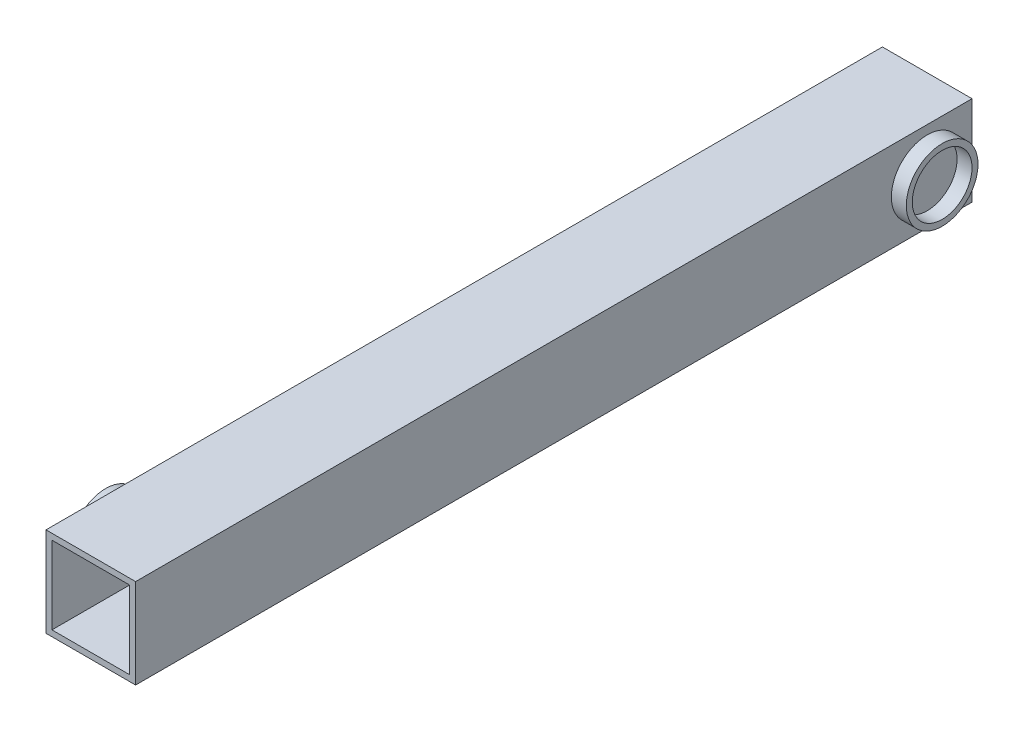
ISO-10303-21;
HEADER;
FILE_DESCRIPTION(('STEP AP214'),'2;1');
FILE_NAME('part.step','',(''),(''),'','','');
FILE_SCHEMA(('AUTOMOTIVE_DESIGN { 1 0 10303 214 1 1 1 1 }'));
ENDSEC;
DATA;
#1=APPLICATION_CONTEXT('core data for automotive mechanical design processes');
#2=APPLICATION_PROTOCOL_DEFINITION('international standard','automotive_design',2000,#1);
#3=PRODUCT_CONTEXT('',#1,'mechanical');
#4=PRODUCT('Part','Part','',(#3));
#5=PRODUCT_RELATED_PRODUCT_CATEGORY('part','',(#4));
#6=PRODUCT_DEFINITION_FORMATION('','',#4);
#7=PRODUCT_DEFINITION_CONTEXT('part definition',#1,'design');
#8=PRODUCT_DEFINITION('design','',#6,#7);
#9=PRODUCT_DEFINITION_SHAPE('','',#8);
#10=(LENGTH_UNIT() NAMED_UNIT(*) SI_UNIT(.MILLI.,.METRE.));
#11=(NAMED_UNIT(*) PLANE_ANGLE_UNIT() SI_UNIT($,.RADIAN.));
#12=(NAMED_UNIT(*) SI_UNIT($,.STERADIAN.) SOLID_ANGLE_UNIT());
#13=UNCERTAINTY_MEASURE_WITH_UNIT(LENGTH_MEASURE(1.E-05),#10,'distance_accuracy_value','');
#14=(GEOMETRIC_REPRESENTATION_CONTEXT(3) GLOBAL_UNCERTAINTY_ASSIGNED_CONTEXT((#13)) GLOBAL_UNIT_ASSIGNED_CONTEXT((#10,
#11,#12)) REPRESENTATION_CONTEXT('',''));
#15=CARTESIAN_POINT('',(0.,0.,0.));
#16=DIRECTION('',(0.,0.,1.));
#17=DIRECTION('',(1.,0.,0.));
#18=AXIS2_PLACEMENT_3D('',#15,#16,#17);
#19=CARTESIAN_POINT('',(0.,0.,280.));
#20=DIRECTION('',(0.,0.,1.));
#21=DIRECTION('',(1.,0.,0.));
#22=AXIS2_PLACEMENT_3D('',#19,#20,#21);
#23=PLANE('',#22);
#24=DIRECTION('',(0.,1.,0.));
#25=VECTOR('',#24,1.);
#26=CARTESIAN_POINT('',(15.,15.,280.));
#27=LINE('',#26,#25);
#28=CARTESIAN_POINT('',(15.,-15.,280.));
#29=VERTEX_POINT('',#28);
#30=CARTESIAN_POINT('',(15.,15.,280.));
#31=VERTEX_POINT('',#30);
#32=EDGE_CURVE('E136',#29,#31,#27,.T.);
#33=ORIENTED_EDGE('',*,*,#32,.T.);
#34=DIRECTION('',(-1.,0.,0.));
#35=VECTOR('',#34,1.);
#36=CARTESIAN_POINT('',(-15.,15.,280.));
#37=LINE('',#36,#35);
#38=CARTESIAN_POINT('',(-15.,15.,280.));
#39=VERTEX_POINT('',#38);
#40=EDGE_CURVE('E139',#31,#39,#37,.T.);
#41=ORIENTED_EDGE('',*,*,#40,.T.);
#42=DIRECTION('',(0.,-1.,0.));
#43=VECTOR('',#42,1.);
#44=CARTESIAN_POINT('',(-15.,15.,280.));
#45=LINE('',#44,#43);
#46=CARTESIAN_POINT('',(-15.,-15.,280.));
#47=VERTEX_POINT('',#46);
#48=EDGE_CURVE('E142',#39,#47,#45,.T.);
#49=ORIENTED_EDGE('',*,*,#48,.T.);
#50=DIRECTION('',(1.,0.,0.));
#51=VECTOR('',#50,1.);
#52=CARTESIAN_POINT('',(-15.,-15.,280.));
#53=LINE('',#52,#51);
#54=EDGE_CURVE('E144',#47,#29,#53,.T.);
#55=ORIENTED_EDGE('',*,*,#54,.T.);
#56=EDGE_LOOP('',(#33,#41,#49,#55));
#57=FACE_BOUND('',#56,.T.);
#58=DIRECTION('',(0.,-1.,0.));
#59=VECTOR('',#58,1.);
#60=CARTESIAN_POINT('',(-13.,13.,280.));
#61=LINE('',#60,#59);
#62=CARTESIAN_POINT('',(-13.,13.,280.));
#63=VERTEX_POINT('',#62);
#64=CARTESIAN_POINT('',(-13.,-13.,280.));
#65=VERTEX_POINT('',#64);
#66=EDGE_CURVE('E106',#63,#65,#61,.T.);
#67=ORIENTED_EDGE('',*,*,#66,.F.);
#68=DIRECTION('',(-1.,0.,0.));
#69=VECTOR('',#68,1.);
#70=CARTESIAN_POINT('',(-13.,13.,280.));
#71=LINE('',#70,#69);
#72=CARTESIAN_POINT('',(13.,13.,280.));
#73=VERTEX_POINT('',#72);
#74=EDGE_CURVE('E98',#73,#63,#71,.T.);
#75=ORIENTED_EDGE('',*,*,#74,.F.);
#76=DIRECTION('',(0.,1.,0.));
#77=VECTOR('',#76,1.);
#78=CARTESIAN_POINT('',(13.,13.,280.));
#79=LINE('',#78,#77);
#80=CARTESIAN_POINT('',(13.,-13.,280.));
#81=VERTEX_POINT('',#80);
#82=EDGE_CURVE('E120',#81,#73,#79,.T.);
#83=ORIENTED_EDGE('',*,*,#82,.F.);
#84=DIRECTION('',(1.,0.,0.));
#85=VECTOR('',#84,1.);
#86=CARTESIAN_POINT('',(-13.,-13.,280.));
#87=LINE('',#86,#85);
#88=EDGE_CURVE('E118',#65,#81,#87,.T.);
#89=ORIENTED_EDGE('',*,*,#88,.F.);
#90=EDGE_LOOP('',(#67,#75,#83,#89));
#91=FACE_BOUND('',#90,.T.);
#92=ADVANCED_FACE('F33',(#57,#91),#23,.T.);
#93=CARTESIAN_POINT('',(0.,0.,0.));
#94=DIRECTION('',(0.,0.,1.));
#95=DIRECTION('',(1.,0.,0.));
#96=AXIS2_PLACEMENT_3D('',#93,#94,#95);
#97=PLANE('',#96);
#98=DIRECTION('',(0.,1.,0.));
#99=VECTOR('',#98,1.);
#100=CARTESIAN_POINT('',(15.,15.,0.));
#101=LINE('',#100,#99);
#102=CARTESIAN_POINT('',(15.,-15.,0.));
#103=VERTEX_POINT('',#102);
#104=CARTESIAN_POINT('',(15.,15.,0.));
#105=VERTEX_POINT('',#104);
#106=EDGE_CURVE('E114',#103,#105,#101,.T.);
#107=ORIENTED_EDGE('',*,*,#106,.F.);
#108=DIRECTION('',(1.,0.,0.));
#109=VECTOR('',#108,1.);
#110=CARTESIAN_POINT('',(-15.,-15.,0.));
#111=LINE('',#110,#109);
#112=CARTESIAN_POINT('',(-15.,-15.,0.));
#113=VERTEX_POINT('',#112);
#114=EDGE_CURVE('E140',#113,#103,#111,.T.);
#115=ORIENTED_EDGE('',*,*,#114,.F.);
#116=DIRECTION('',(0.,-1.,0.));
#117=VECTOR('',#116,1.);
#118=CARTESIAN_POINT('',(-15.,15.,0.));
#119=LINE('',#118,#117);
#120=CARTESIAN_POINT('',(-15.,15.,0.));
#121=VERTEX_POINT('',#120);
#122=EDGE_CURVE('E151',#121,#113,#119,.T.);
#123=ORIENTED_EDGE('',*,*,#122,.F.);
#124=DIRECTION('',(-1.,0.,0.));
#125=VECTOR('',#124,1.);
#126=CARTESIAN_POINT('',(-15.,15.,0.));
#127=LINE('',#126,#125);
#128=EDGE_CURVE('E149',#105,#121,#127,.T.);
#129=ORIENTED_EDGE('',*,*,#128,.F.);
#130=EDGE_LOOP('',(#107,#115,#123,#129));
#131=FACE_BOUND('',#130,.T.);
#132=DIRECTION('',(-1.,0.,0.));
#133=VECTOR('',#132,1.);
#134=CARTESIAN_POINT('',(-13.,13.,0.));
#135=LINE('',#134,#133);
#136=CARTESIAN_POINT('',(13.,13.,0.));
#137=VERTEX_POINT('',#136);
#138=CARTESIAN_POINT('',(-13.,13.,0.));
#139=VERTEX_POINT('',#138);
#140=EDGE_CURVE('E56',#137,#139,#135,.T.);
#141=ORIENTED_EDGE('',*,*,#140,.T.);
#142=DIRECTION('',(0.,-1.,0.));
#143=VECTOR('',#142,1.);
#144=CARTESIAN_POINT('',(-13.,13.,0.));
#145=LINE('',#144,#143);
#146=CARTESIAN_POINT('',(-13.,-13.,0.));
#147=VERTEX_POINT('',#146);
#148=EDGE_CURVE('E113',#139,#147,#145,.T.);
#149=ORIENTED_EDGE('',*,*,#148,.T.);
#150=DIRECTION('',(1.,0.,0.));
#151=VECTOR('',#150,1.);
#152=CARTESIAN_POINT('',(-13.,-13.,0.));
#153=LINE('',#152,#151);
#154=CARTESIAN_POINT('',(13.,-13.,0.));
#155=VERTEX_POINT('',#154);
#156=EDGE_CURVE('E128',#147,#155,#153,.T.);
#157=ORIENTED_EDGE('',*,*,#156,.T.);
#158=DIRECTION('',(0.,1.,0.));
#159=VECTOR('',#158,1.);
#160=CARTESIAN_POINT('',(13.,13.,0.));
#161=LINE('',#160,#159);
#162=EDGE_CURVE('E107',#155,#137,#161,.T.);
#163=ORIENTED_EDGE('',*,*,#162,.T.);
#164=EDGE_LOOP('',(#141,#149,#157,#163));
#165=FACE_BOUND('',#164,.T.);
#166=ADVANCED_FACE('F172',(#131,#165),#97,.F.);
#167=CARTESIAN_POINT('',(15.,15.,280.));
#168=DIRECTION('',(-1.,0.,0.));
#169=DIRECTION('',(0.,0.,1.));
#170=AXIS2_PLACEMENT_3D('',#167,#168,#169);
#171=PLANE('',#170);
#172=CARTESIAN_POINT('',(15.,0.,15.));
#173=DIRECTION('',(-1.,0.,0.));
#174=DIRECTION('',(0.,0.,1.));
#175=AXIS2_PLACEMENT_3D('',#172,#173,#174);
#176=CIRCLE('',#175,12.);
#177=CARTESIAN_POINT('',(15.,0.,27.));
#178=VERTEX_POINT('',#177);
#179=EDGE_CURVE('E41',#178,#178,#176,.F.);
#180=ORIENTED_EDGE('',*,*,#179,.F.);
#181=EDGE_LOOP('',(#180));
#182=FACE_BOUND('',#181,.T.);
#183=ORIENTED_EDGE('',*,*,#106,.T.);
#184=DIRECTION('',(0.,0.,-1.));
#185=VECTOR('',#184,1.);
#186=CARTESIAN_POINT('',(15.,15.,280.));
#187=LINE('',#186,#185);
#188=EDGE_CURVE('E162',#31,#105,#187,.T.);
#189=ORIENTED_EDGE('',*,*,#188,.F.);
#190=ORIENTED_EDGE('',*,*,#32,.F.);
#191=DIRECTION('',(0.,0.,-1.));
#192=VECTOR('',#191,1.);
#193=CARTESIAN_POINT('',(15.,-15.,280.));
#194=LINE('',#193,#192);
#195=EDGE_CURVE('E146',#29,#103,#194,.T.);
#196=ORIENTED_EDGE('',*,*,#195,.T.);
#197=EDGE_LOOP('',(#183,#189,#190,#196));
#198=FACE_BOUND('',#197,.T.);
#199=ADVANCED_FACE('F35',(#182,#198),#171,.F.);
#200=CARTESIAN_POINT('',(-15.,15.,280.));
#201=DIRECTION('',(0.,-1.,0.));
#202=DIRECTION('',(0.,0.,-1.));
#203=AXIS2_PLACEMENT_3D('',#200,#201,#202);
#204=PLANE('',#203);
#205=ORIENTED_EDGE('',*,*,#128,.T.);
#206=DIRECTION('',(0.,0.,-1.));
#207=VECTOR('',#206,1.);
#208=CARTESIAN_POINT('',(-15.,15.,280.));
#209=LINE('',#208,#207);
#210=EDGE_CURVE('E159',#39,#121,#209,.T.);
#211=ORIENTED_EDGE('',*,*,#210,.F.);
#212=ORIENTED_EDGE('',*,*,#40,.F.);
#213=ORIENTED_EDGE('',*,*,#188,.T.);
#214=EDGE_LOOP('',(#205,#211,#212,#213));
#215=FACE_BOUND('',#214,.T.);
#216=ADVANCED_FACE('F171',(#215),#204,.F.);
#217=CARTESIAN_POINT('',(-15.,15.,280.));
#218=DIRECTION('',(1.,0.,0.));
#219=DIRECTION('',(0.,0.,-1.));
#220=AXIS2_PLACEMENT_3D('',#217,#218,#219);
#221=PLANE('',#220);
#222=CARTESIAN_POINT('',(-15.,0.,255.));
#223=DIRECTION('',(1.,0.,0.));
#224=DIRECTION('',(0.,0.,-1.));
#225=AXIS2_PLACEMENT_3D('',#222,#223,#224);
#226=CIRCLE('',#225,12.);
#227=CARTESIAN_POINT('',(-15.,0.,243.));
#228=VERTEX_POINT('',#227);
#229=EDGE_CURVE('E11',#228,#228,#226,.F.);
#230=ORIENTED_EDGE('',*,*,#229,.F.);
#231=EDGE_LOOP('',(#230));
#232=FACE_BOUND('',#231,.T.);
#233=ORIENTED_EDGE('',*,*,#122,.T.);
#234=DIRECTION('',(0.,0.,-1.));
#235=VECTOR('',#234,1.);
#236=CARTESIAN_POINT('',(-15.,-15.,280.));
#237=LINE('',#236,#235);
#238=EDGE_CURVE('E156',#47,#113,#237,.T.);
#239=ORIENTED_EDGE('',*,*,#238,.F.);
#240=ORIENTED_EDGE('',*,*,#48,.F.);
#241=ORIENTED_EDGE('',*,*,#210,.T.);
#242=EDGE_LOOP('',(#233,#239,#240,#241));
#243=FACE_BOUND('',#242,.T.);
#244=ADVANCED_FACE('F191',(#232,#243),#221,.F.);
#245=CARTESIAN_POINT('',(-15.,-15.,280.));
#246=DIRECTION('',(0.,1.,0.));
#247=DIRECTION('',(0.,0.,1.));
#248=AXIS2_PLACEMENT_3D('',#245,#246,#247);
#249=PLANE('',#248);
#250=ORIENTED_EDGE('',*,*,#114,.T.);
#251=ORIENTED_EDGE('',*,*,#195,.F.);
#252=ORIENTED_EDGE('',*,*,#54,.F.);
#253=ORIENTED_EDGE('',*,*,#238,.T.);
#254=EDGE_LOOP('',(#250,#251,#252,#253));
#255=FACE_BOUND('',#254,.T.);
#256=ADVANCED_FACE('F189',(#255),#249,.F.);
#257=CARTESIAN_POINT('',(-13.,13.,280.));
#258=DIRECTION('',(0.,-1.,0.));
#259=DIRECTION('',(0.,0.,-1.));
#260=AXIS2_PLACEMENT_3D('',#257,#258,#259);
#261=PLANE('',#260);
#262=ORIENTED_EDGE('',*,*,#140,.F.);
#263=DIRECTION('',(0.,0.,-1.));
#264=VECTOR('',#263,1.);
#265=CARTESIAN_POINT('',(13.,13.,280.));
#266=LINE('',#265,#264);
#267=EDGE_CURVE('E102',#73,#137,#266,.T.);
#268=ORIENTED_EDGE('',*,*,#267,.F.);
#269=ORIENTED_EDGE('',*,*,#74,.T.);
#270=DIRECTION('',(0.,0.,-1.));
#271=VECTOR('',#270,1.);
#272=CARTESIAN_POINT('',(-13.,13.,280.));
#273=LINE('',#272,#271);
#274=EDGE_CURVE('E101',#63,#139,#273,.T.);
#275=ORIENTED_EDGE('',*,*,#274,.T.);
#276=EDGE_LOOP('',(#262,#268,#269,#275));
#277=FACE_BOUND('',#276,.T.);
#278=ADVANCED_FACE('F100',(#277),#261,.T.);
#279=CARTESIAN_POINT('',(-13.,13.,280.));
#280=DIRECTION('',(1.,0.,0.));
#281=DIRECTION('',(0.,1.,0.));
#282=AXIS2_PLACEMENT_3D('',#279,#280,#281);
#283=PLANE('',#282);
#284=ORIENTED_EDGE('',*,*,#148,.F.);
#285=ORIENTED_EDGE('',*,*,#274,.F.);
#286=ORIENTED_EDGE('',*,*,#66,.T.);
#287=DIRECTION('',(0.,0.,-1.));
#288=VECTOR('',#287,1.);
#289=CARTESIAN_POINT('',(-13.,-13.,280.));
#290=LINE('',#289,#288);
#291=EDGE_CURVE('E115',#65,#147,#290,.T.);
#292=ORIENTED_EDGE('',*,*,#291,.T.);
#293=EDGE_LOOP('',(#284,#285,#286,#292));
#294=FACE_BOUND('',#293,.T.);
#295=ADVANCED_FACE('F110',(#294),#283,.T.);
#296=CARTESIAN_POINT('',(-13.,-13.,280.));
#297=DIRECTION('',(0.,1.,0.));
#298=DIRECTION('',(-1.,0.,0.));
#299=AXIS2_PLACEMENT_3D('',#296,#297,#298);
#300=PLANE('',#299);
#301=ORIENTED_EDGE('',*,*,#156,.F.);
#302=ORIENTED_EDGE('',*,*,#291,.F.);
#303=ORIENTED_EDGE('',*,*,#88,.T.);
#304=DIRECTION('',(0.,0.,-1.));
#305=VECTOR('',#304,1.);
#306=CARTESIAN_POINT('',(13.,-13.,280.));
#307=LINE('',#306,#305);
#308=EDGE_CURVE('E48',#81,#155,#307,.T.);
#309=ORIENTED_EDGE('',*,*,#308,.T.);
#310=EDGE_LOOP('',(#301,#302,#303,#309));
#311=FACE_BOUND('',#310,.T.);
#312=ADVANCED_FACE('F216',(#311),#300,.T.);
#313=CARTESIAN_POINT('',(13.,13.,280.));
#314=DIRECTION('',(-1.,0.,0.));
#315=DIRECTION('',(0.,-1.,0.));
#316=AXIS2_PLACEMENT_3D('',#313,#314,#315);
#317=PLANE('',#316);
#318=ORIENTED_EDGE('',*,*,#162,.F.);
#319=ORIENTED_EDGE('',*,*,#308,.F.);
#320=ORIENTED_EDGE('',*,*,#82,.T.);
#321=ORIENTED_EDGE('',*,*,#267,.T.);
#322=EDGE_LOOP('',(#318,#319,#320,#321));
#323=FACE_BOUND('',#322,.T.);
#324=ADVANCED_FACE('F219',(#323),#317,.T.);
#325=CARTESIAN_POINT('',(20.,0.,15.));
#326=DIRECTION('',(1.,0.,0.));
#327=DIRECTION('',(0.,0.,-1.));
#328=AXIS2_PLACEMENT_3D('',#325,#326,#327);
#329=PLANE('',#328);
#330=CARTESIAN_POINT('',(20.,0.,15.));
#331=DIRECTION('',(1.,0.,0.));
#332=DIRECTION('',(0.,0.,-1.));
#333=AXIS2_PLACEMENT_3D('',#330,#331,#332);
#334=CIRCLE('',#333,12.);
#335=CARTESIAN_POINT('',(20.,0.,3.));
#336=VERTEX_POINT('',#335);
#337=EDGE_CURVE('E126',#336,#336,#334,.T.);
#338=ORIENTED_EDGE('',*,*,#337,.T.);
#339=EDGE_LOOP('',(#338));
#340=FACE_BOUND('',#339,.T.);
#341=CARTESIAN_POINT('',(20.,0.,15.));
#342=DIRECTION('',(1.,0.,0.));
#343=DIRECTION('',(0.,0.,-1.));
#344=AXIS2_PLACEMENT_3D('',#341,#342,#343);
#345=CIRCLE('',#344,10.);
#346=CARTESIAN_POINT('',(20.,0.,5.));
#347=VERTEX_POINT('',#346);
#348=EDGE_CURVE('E260',#347,#347,#345,.T.);
#349=ORIENTED_EDGE('',*,*,#348,.F.);
#350=EDGE_LOOP('',(#349));
#351=FACE_BOUND('',#350,.T.);
#352=ADVANCED_FACE('F223',(#340,#351),#329,.T.);
#353=CARTESIAN_POINT('',(20.,0.,15.));
#354=DIRECTION('',(-1.,0.,0.));
#355=DIRECTION('',(0.,0.,1.));
#356=AXIS2_PLACEMENT_3D('',#353,#354,#355);
#357=CYLINDRICAL_SURFACE('',#356,12.);
#358=ORIENTED_EDGE('',*,*,#337,.F.);
#359=EDGE_LOOP('',(#358));
#360=FACE_BOUND('',#359,.T.);
#361=ORIENTED_EDGE('',*,*,#179,.T.);
#362=EDGE_LOOP('',(#361));
#363=FACE_BOUND('',#362,.T.);
#364=ADVANCED_FACE('F167',(#360,#363),#357,.T.);
#365=CARTESIAN_POINT('',(20.,0.,15.));
#366=DIRECTION('',(-1.,0.,0.));
#367=DIRECTION('',(0.,0.,1.));
#368=AXIS2_PLACEMENT_3D('',#365,#366,#367);
#369=CYLINDRICAL_SURFACE('',#368,10.);
#370=ORIENTED_EDGE('',*,*,#348,.T.);
#371=EDGE_LOOP('',(#370));
#372=FACE_BOUND('',#371,.T.);
#373=CARTESIAN_POINT('',(15.,0.,15.));
#374=DIRECTION('',(1.,0.,0.));
#375=DIRECTION('',(0.,0.,-1.));
#376=AXIS2_PLACEMENT_3D('',#373,#374,#375);
#377=CIRCLE('',#376,10.);
#378=CARTESIAN_POINT('',(15.,0.,5.));
#379=VERTEX_POINT('',#378);
#380=EDGE_CURVE('E259',#379,#379,#377,.T.);
#381=ORIENTED_EDGE('',*,*,#380,.F.);
#382=EDGE_LOOP('',(#381));
#383=FACE_BOUND('',#382,.T.);
#384=ADVANCED_FACE('F226',(#372,#383),#369,.F.);
#385=ORIENTED_EDGE('',*,*,#380,.T.);
#386=EDGE_LOOP('',(#385));
#387=FACE_BOUND('',#386,.T.);
#388=ADVANCED_FACE('F173',(#387),#171,.F.);
#389=CARTESIAN_POINT('',(-20.,0.,255.));
#390=DIRECTION('',(-1.,0.,0.));
#391=DIRECTION('',(0.,0.,1.));
#392=AXIS2_PLACEMENT_3D('',#389,#390,#391);
#393=PLANE('',#392);
#394=CARTESIAN_POINT('',(-20.,0.,255.));
#395=DIRECTION('',(-1.,0.,0.));
#396=DIRECTION('',(0.,0.,1.));
#397=AXIS2_PLACEMENT_3D('',#394,#395,#396);
#398=CIRCLE('',#397,12.);
#399=CARTESIAN_POINT('',(-20.,0.,267.));
#400=VERTEX_POINT('',#399);
#401=EDGE_CURVE('E254',#400,#400,#398,.T.);
#402=ORIENTED_EDGE('',*,*,#401,.T.);
#403=EDGE_LOOP('',(#402));
#404=FACE_BOUND('',#403,.T.);
#405=CARTESIAN_POINT('',(-20.,0.,255.));
#406=DIRECTION('',(-1.,0.,0.));
#407=DIRECTION('',(0.,0.,1.));
#408=AXIS2_PLACEMENT_3D('',#405,#406,#407);
#409=CIRCLE('',#408,9.99999999999998);
#410=CARTESIAN_POINT('',(-20.,0.,265.));
#411=VERTEX_POINT('',#410);
#412=EDGE_CURVE('E249',#411,#411,#409,.T.);
#413=ORIENTED_EDGE('',*,*,#412,.F.);
#414=EDGE_LOOP('',(#413));
#415=FACE_BOUND('',#414,.T.);
#416=ADVANCED_FACE('F237',(#404,#415),#393,.T.);
#417=CARTESIAN_POINT('',(-20.,0.,255.));
#418=DIRECTION('',(1.,0.,0.));
#419=DIRECTION('',(0.,0.,-1.));
#420=AXIS2_PLACEMENT_3D('',#417,#418,#419);
#421=CYLINDRICAL_SURFACE('',#420,12.);
#422=ORIENTED_EDGE('',*,*,#401,.F.);
#423=EDGE_LOOP('',(#422));
#424=FACE_BOUND('',#423,.T.);
#425=ORIENTED_EDGE('',*,*,#229,.T.);
#426=EDGE_LOOP('',(#425));
#427=FACE_BOUND('',#426,.T.);
#428=ADVANCED_FACE('F234',(#424,#427),#421,.T.);
#429=CARTESIAN_POINT('',(-20.,0.,255.));
#430=DIRECTION('',(1.,0.,0.));
#431=DIRECTION('',(0.,0.,-1.));
#432=AXIS2_PLACEMENT_3D('',#429,#430,#431);
#433=CYLINDRICAL_SURFACE('',#432,9.99999999999998);
#434=ORIENTED_EDGE('',*,*,#412,.T.);
#435=EDGE_LOOP('',(#434));
#436=FACE_BOUND('',#435,.T.);
#437=CARTESIAN_POINT('',(-15.,0.,255.));
#438=DIRECTION('',(-1.,0.,0.));
#439=DIRECTION('',(0.,0.,1.));
#440=AXIS2_PLACEMENT_3D('',#437,#438,#439);
#441=CIRCLE('',#440,9.99999999999998);
#442=CARTESIAN_POINT('',(-15.,0.,265.));
#443=VERTEX_POINT('',#442);
#444=EDGE_CURVE('E252',#443,#443,#441,.T.);
#445=ORIENTED_EDGE('',*,*,#444,.F.);
#446=EDGE_LOOP('',(#445));
#447=FACE_BOUND('',#446,.T.);
#448=ADVANCED_FACE('F203',(#436,#447),#433,.F.);
#449=ORIENTED_EDGE('',*,*,#444,.T.);
#450=EDGE_LOOP('',(#449));
#451=FACE_BOUND('',#450,.T.);
#452=ADVANCED_FACE('F195',(#451),#221,.F.);
#453=CLOSED_SHELL('',(#92,#166,#199,#216,#244,#256,#278,#295,#312,#324,#352,#364,#384,#388,#416,
#428,#448,#452));
#454=MANIFOLD_SOLID_BREP('B2',#453);
#455=ADVANCED_BREP_SHAPE_REPRESENTATION('',(#18,#454),#14);
#456=SHAPE_DEFINITION_REPRESENTATION(#9,#455);
ENDSEC;
END-ISO-10303-21;
